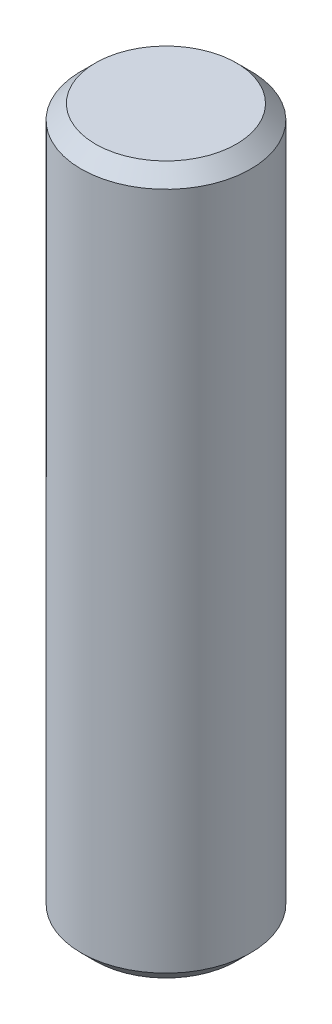
ISO-10303-21;
HEADER;
FILE_DESCRIPTION(('STEP AP214'),'2;1');
FILE_NAME('part.step','',(''),(''),'','','');
FILE_SCHEMA(('AUTOMOTIVE_DESIGN { 1 0 10303 214 1 1 1 1 }'));
ENDSEC;
DATA;
#1=APPLICATION_CONTEXT('core data for automotive mechanical design processes');
#2=APPLICATION_PROTOCOL_DEFINITION('international standard','automotive_design',2000,#1);
#3=PRODUCT_CONTEXT('',#1,'mechanical');
#4=PRODUCT('Part','Part','',(#3));
#5=PRODUCT_RELATED_PRODUCT_CATEGORY('part','',(#4));
#6=PRODUCT_DEFINITION_FORMATION('','',#4);
#7=PRODUCT_DEFINITION_CONTEXT('part definition',#1,'design');
#8=PRODUCT_DEFINITION('design','',#6,#7);
#9=PRODUCT_DEFINITION_SHAPE('','',#8);
#10=(LENGTH_UNIT() NAMED_UNIT(*) SI_UNIT(.MILLI.,.METRE.));
#11=(NAMED_UNIT(*) PLANE_ANGLE_UNIT() SI_UNIT($,.RADIAN.));
#12=(NAMED_UNIT(*) SI_UNIT($,.STERADIAN.) SOLID_ANGLE_UNIT());
#13=UNCERTAINTY_MEASURE_WITH_UNIT(LENGTH_MEASURE(1.E-05),#10,'distance_accuracy_value','');
#14=(GEOMETRIC_REPRESENTATION_CONTEXT(3) GLOBAL_UNCERTAINTY_ASSIGNED_CONTEXT((#13)) GLOBAL_UNIT_ASSIGNED_CONTEXT((#10,
#11,#12)) REPRESENTATION_CONTEXT('',''));
#15=CARTESIAN_POINT('',(0.,0.,0.));
#16=DIRECTION('',(0.,0.,1.));
#17=DIRECTION('',(1.,0.,0.));
#18=AXIS2_PLACEMENT_3D('',#15,#16,#17);
#19=CARTESIAN_POINT('',(-5.6857622137112E-11,0.508000000000005,0.));
#20=DIRECTION('',(0.,1.,0.));
#21=DIRECTION('',(0.,0.,1.));
#22=AXIS2_PLACEMENT_3D('',#19,#20,#21);
#23=CONICAL_SURFACE('',#22,2.99618999995139,0.785398163397448);
#24=CARTESIAN_POINT('',(-5.6857622137112E-11,5.6843441845684E-11,0.));
#25=DIRECTION('',(0.,1.,0.));
#26=DIRECTION('',(0.,0.,1.));
#27=AXIS2_PLACEMENT_3D('',#24,#25,#26);
#28=CIRCLE('',#27,2.48819000000823);
#29=CARTESIAN_POINT('',(-5.6857622137112E-11,5.6843441845684E-11,2.48819000000823));
#30=VERTEX_POINT('',#29);
#31=EDGE_CURVE('E45',#30,#30,#28,.T.);
#32=ORIENTED_EDGE('',*,*,#31,.T.);
#33=EDGE_LOOP('',(#32));
#34=FACE_BOUND('',#33,.T.);
#35=CARTESIAN_POINT('',(-5.6857622137112E-11,0.508000000000005,0.));
#36=DIRECTION('',(0.,1.,0.));
#37=DIRECTION('',(0.,0.,1.));
#38=AXIS2_PLACEMENT_3D('',#35,#36,#37);
#39=CIRCLE('',#38,2.99618999995139);
#40=CARTESIAN_POINT('',(-5.6857622137112E-11,0.508000000000005,2.99618999995139));
#41=VERTEX_POINT('',#40);
#42=EDGE_CURVE('E10',#41,#41,#39,.T.);
#43=ORIENTED_EDGE('',*,*,#42,.F.);
#44=EDGE_LOOP('',(#43));
#45=FACE_BOUND('',#44,.T.);
#46=ADVANCED_FACE('F31',(#34,#45),#23,.T.);
#47=CARTESIAN_POINT('',(-5.6857622137112E-11,5.6843441845684E-11,0.));
#48=DIRECTION('',(0.,1.,0.));
#49=DIRECTION('',(0.,0.,1.));
#50=AXIS2_PLACEMENT_3D('',#47,#48,#49);
#51=CYLINDRICAL_SURFACE('',#50,2.99618999995139);
#52=ORIENTED_EDGE('',*,*,#42,.T.);
#53=EDGE_LOOP('',(#52));
#54=FACE_BOUND('',#53,.T.);
#55=CARTESIAN_POINT('',(-5.6857622137112E-11,24.492,0.));
#56=DIRECTION('',(0.,1.,0.));
#57=DIRECTION('',(0.,0.,1.));
#58=AXIS2_PLACEMENT_3D('',#55,#56,#57);
#59=CIRCLE('',#58,2.9961899999514);
#60=CARTESIAN_POINT('',(-5.6857622137112E-11,24.492,2.9961899999514));
#61=VERTEX_POINT('',#60);
#62=EDGE_CURVE('E37',#61,#61,#59,.T.);
#63=ORIENTED_EDGE('',*,*,#62,.F.);
#64=EDGE_LOOP('',(#63));
#65=FACE_BOUND('',#64,.T.);
#66=ADVANCED_FACE('F64',(#54,#65),#51,.T.);
#67=CARTESIAN_POINT('',(-5.6857622137112E-11,24.9999999999886,0.));
#68=DIRECTION('',(0.,-1.,0.));
#69=DIRECTION('',(0.,0.,-1.));
#70=AXIS2_PLACEMENT_3D('',#67,#68,#69);
#71=CONICAL_SURFACE('',#70,2.48818999996276,0.785398163397448);
#72=ORIENTED_EDGE('',*,*,#62,.T.);
#73=EDGE_LOOP('',(#72));
#74=FACE_BOUND('',#73,.T.);
#75=CARTESIAN_POINT('',(-5.6857622137112E-11,24.9999999999886,0.));
#76=DIRECTION('',(0.,1.,0.));
#77=DIRECTION('',(0.,0.,1.));
#78=AXIS2_PLACEMENT_3D('',#75,#76,#77);
#79=CIRCLE('',#78,2.48818999996276);
#80=CARTESIAN_POINT('',(-5.6857622137112E-11,24.9999999999886,2.48818999996276));
#81=VERTEX_POINT('',#80);
#82=EDGE_CURVE('E41',#81,#81,#79,.T.);
#83=ORIENTED_EDGE('',*,*,#82,.F.);
#84=EDGE_LOOP('',(#83));
#85=FACE_BOUND('',#84,.T.);
#86=ADVANCED_FACE('F60',(#74,#85),#71,.T.);
#87=CARTESIAN_POINT('',(-5.6857622137112E-11,24.9999999999886,0.));
#88=DIRECTION('',(0.,1.,0.));
#89=DIRECTION('',(0.,0.,1.));
#90=AXIS2_PLACEMENT_3D('',#87,#88,#89);
#91=PLANE('',#90);
#92=ORIENTED_EDGE('',*,*,#82,.T.);
#93=EDGE_LOOP('',(#92));
#94=FACE_BOUND('',#93,.T.);
#95=ADVANCED_FACE('F55',(#94),#91,.T.);
#96=CARTESIAN_POINT('',(2.48818999995137,5.6843441845684E-11,0.));
#97=DIRECTION('',(0.,-1.,0.));
#98=DIRECTION('',(0.,0.,-1.));
#99=AXIS2_PLACEMENT_3D('',#96,#97,#98);
#100=PLANE('',#99);
#101=ORIENTED_EDGE('',*,*,#31,.F.);
#102=EDGE_LOOP('',(#101));
#103=FACE_BOUND('',#102,.T.);
#104=ADVANCED_FACE('F53',(#103),#100,.T.);
#105=CLOSED_SHELL('',(#46,#66,#86,#95,#104));
#106=MANIFOLD_SOLID_BREP('B2',#105);
#107=ADVANCED_BREP_SHAPE_REPRESENTATION('',(#18,#106),#14);
#108=SHAPE_DEFINITION_REPRESENTATION(#9,#107);
ENDSEC;
END-ISO-10303-21;
